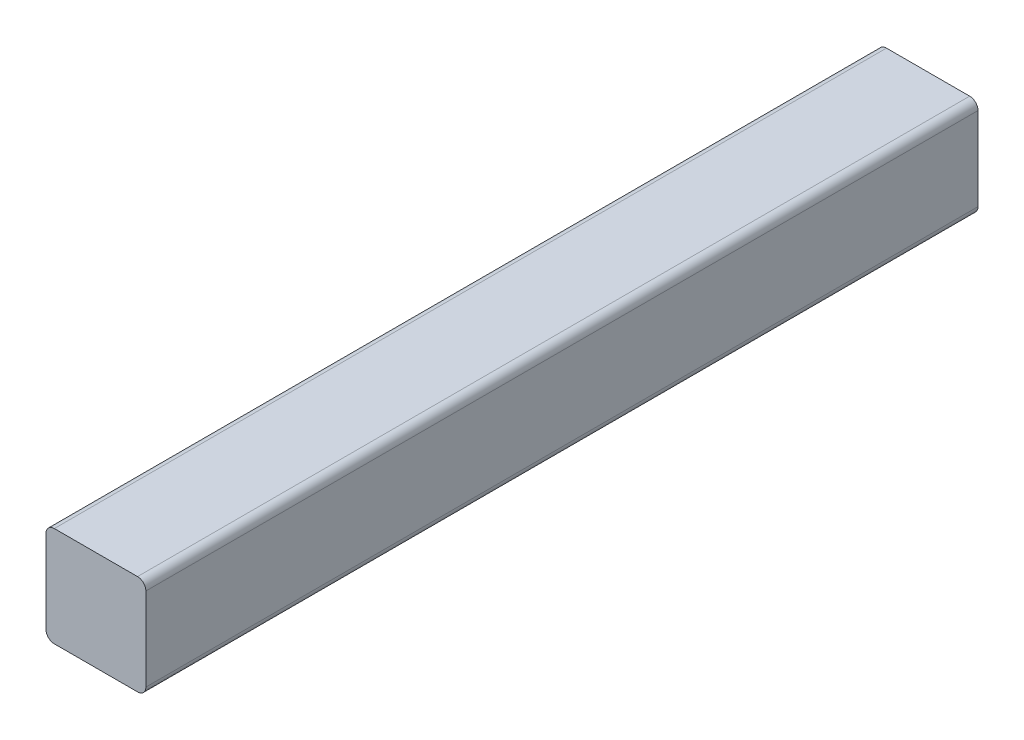
ISO-10303-21;
HEADER;
FILE_DESCRIPTION(('STEP AP214'),'2;1');
FILE_NAME('part.step','',(''),(''),'','','');
FILE_SCHEMA(('AUTOMOTIVE_DESIGN { 1 0 10303 214 1 1 1 1 }'));
ENDSEC;
DATA;
#1=APPLICATION_CONTEXT('core data for automotive mechanical design processes');
#2=APPLICATION_PROTOCOL_DEFINITION('international standard','automotive_design',2000,#1);
#3=PRODUCT_CONTEXT('',#1,'mechanical');
#4=PRODUCT('Part','Part','',(#3));
#5=PRODUCT_RELATED_PRODUCT_CATEGORY('part','',(#4));
#6=PRODUCT_DEFINITION_FORMATION('','',#4);
#7=PRODUCT_DEFINITION_CONTEXT('part definition',#1,'design');
#8=PRODUCT_DEFINITION('design','',#6,#7);
#9=PRODUCT_DEFINITION_SHAPE('','',#8);
#10=(LENGTH_UNIT() NAMED_UNIT(*) SI_UNIT(.MILLI.,.METRE.));
#11=(NAMED_UNIT(*) PLANE_ANGLE_UNIT() SI_UNIT($,.RADIAN.));
#12=(NAMED_UNIT(*) SI_UNIT($,.STERADIAN.) SOLID_ANGLE_UNIT());
#13=UNCERTAINTY_MEASURE_WITH_UNIT(LENGTH_MEASURE(1.E-05),#10,'distance_accuracy_value','');
#14=(GEOMETRIC_REPRESENTATION_CONTEXT(3) GLOBAL_UNCERTAINTY_ASSIGNED_CONTEXT((#13)) GLOBAL_UNIT_ASSIGNED_CONTEXT((#10,
#11,#12)) REPRESENTATION_CONTEXT('',''));
#15=CARTESIAN_POINT('',(0.,0.,0.));
#16=DIRECTION('',(0.,0.,1.));
#17=DIRECTION('',(1.,0.,0.));
#18=AXIS2_PLACEMENT_3D('',#15,#16,#17);
#19=CARTESIAN_POINT('',(19.05,-19.05,317.5));
#20=DIRECTION('',(-1.,0.,0.));
#21=DIRECTION('',(0.,0.,1.));
#22=AXIS2_PLACEMENT_3D('',#19,#20,#21);
#23=PLANE('',#22);
#24=DIRECTION('',(0.,1.,0.));
#25=VECTOR('',#24,1.);
#26=CARTESIAN_POINT('',(19.05,-19.05,317.5));
#27=LINE('',#26,#25);
#28=CARTESIAN_POINT('',(19.05,-15.875,317.5));
#29=VERTEX_POINT('',#28);
#30=CARTESIAN_POINT('',(19.05,15.875,317.5));
#31=VERTEX_POINT('',#30);
#32=EDGE_CURVE('E134',#29,#31,#27,.T.);
#33=ORIENTED_EDGE('',*,*,#32,.F.);
#34=DIRECTION('',(0.,0.,-1.));
#35=VECTOR('',#34,1.);
#36=CARTESIAN_POINT('',(19.05,-15.875,317.5));
#37=LINE('',#36,#35);
#38=CARTESIAN_POINT('',(19.05,-15.875,0.));
#39=VERTEX_POINT('',#38);
#40=EDGE_CURVE('E11',#29,#39,#37,.T.);
#41=ORIENTED_EDGE('',*,*,#40,.T.);
#42=DIRECTION('',(0.,1.,0.));
#43=VECTOR('',#42,1.);
#44=CARTESIAN_POINT('',(19.05,-19.05,0.));
#45=LINE('',#44,#43);
#46=CARTESIAN_POINT('',(19.05,15.875,0.));
#47=VERTEX_POINT('',#46);
#48=EDGE_CURVE('E136',#39,#47,#45,.T.);
#49=ORIENTED_EDGE('',*,*,#48,.T.);
#50=DIRECTION('',(0.,0.,-1.));
#51=VECTOR('',#50,1.);
#52=CARTESIAN_POINT('',(19.05,15.875,317.5));
#53=LINE('',#52,#51);
#54=EDGE_CURVE('E47',#47,#31,#53,.F.);
#55=ORIENTED_EDGE('',*,*,#54,.T.);
#56=EDGE_LOOP('',(#33,#41,#49,#55));
#57=FACE_BOUND('',#56,.T.);
#58=ADVANCED_FACE('F39',(#57),#23,.F.);
#59=CARTESIAN_POINT('',(-19.05,19.05,317.5));
#60=DIRECTION('',(0.,-1.,0.));
#61=DIRECTION('',(0.,0.,-1.));
#62=AXIS2_PLACEMENT_3D('',#59,#60,#61);
#63=PLANE('',#62);
#64=DIRECTION('',(-1.,0.,0.));
#65=VECTOR('',#64,1.);
#66=CARTESIAN_POINT('',(-19.05,19.05,0.));
#67=LINE('',#66,#65);
#68=CARTESIAN_POINT('',(15.875,19.05,0.));
#69=VERTEX_POINT('',#68);
#70=CARTESIAN_POINT('',(-15.875,19.05,0.));
#71=VERTEX_POINT('',#70);
#72=EDGE_CURVE('E132',#69,#71,#67,.T.);
#73=ORIENTED_EDGE('',*,*,#72,.T.);
#74=DIRECTION('',(0.,0.,-1.));
#75=VECTOR('',#74,1.);
#76=CARTESIAN_POINT('',(-15.875,19.05,317.5));
#77=LINE('',#76,#75);
#78=CARTESIAN_POINT('',(-15.875,19.05,317.5));
#79=VERTEX_POINT('',#78);
#80=EDGE_CURVE('E111',#71,#79,#77,.F.);
#81=ORIENTED_EDGE('',*,*,#80,.T.);
#82=DIRECTION('',(-1.,0.,0.));
#83=VECTOR('',#82,1.);
#84=CARTESIAN_POINT('',(-19.05,19.05,317.5));
#85=LINE('',#84,#83);
#86=CARTESIAN_POINT('',(15.875,19.05,317.5));
#87=VERTEX_POINT('',#86);
#88=EDGE_CURVE('E172',#87,#79,#85,.T.);
#89=ORIENTED_EDGE('',*,*,#88,.F.);
#90=DIRECTION('',(0.,0.,-1.));
#91=VECTOR('',#90,1.);
#92=CARTESIAN_POINT('',(15.875,19.05,317.5));
#93=LINE('',#92,#91);
#94=EDGE_CURVE('E116',#87,#69,#93,.T.);
#95=ORIENTED_EDGE('',*,*,#94,.T.);
#96=EDGE_LOOP('',(#73,#81,#89,#95));
#97=FACE_BOUND('',#96,.T.);
#98=ADVANCED_FACE('F176',(#97),#63,.F.);
#99=CARTESIAN_POINT('',(-19.05,-19.05,317.5));
#100=DIRECTION('',(1.,0.,0.));
#101=DIRECTION('',(0.,0.,-1.));
#102=AXIS2_PLACEMENT_3D('',#99,#100,#101);
#103=PLANE('',#102);
#104=DIRECTION('',(0.,-1.,0.));
#105=VECTOR('',#104,1.);
#106=CARTESIAN_POINT('',(-19.05,-19.05,317.5));
#107=LINE('',#106,#105);
#108=CARTESIAN_POINT('',(-19.05,15.875,317.5));
#109=VERTEX_POINT('',#108);
#110=CARTESIAN_POINT('',(-19.05,-15.875,317.5));
#111=VERTEX_POINT('',#110);
#112=EDGE_CURVE('E125',#109,#111,#107,.T.);
#113=ORIENTED_EDGE('',*,*,#112,.F.);
#114=DIRECTION('',(0.,0.,-1.));
#115=VECTOR('',#114,1.);
#116=CARTESIAN_POINT('',(-19.05,15.875,317.5));
#117=LINE('',#116,#115);
#118=CARTESIAN_POINT('',(-19.05,15.875,0.));
#119=VERTEX_POINT('',#118);
#120=EDGE_CURVE('E110',#109,#119,#117,.T.);
#121=ORIENTED_EDGE('',*,*,#120,.T.);
#122=DIRECTION('',(0.,-1.,0.));
#123=VECTOR('',#122,1.);
#124=CARTESIAN_POINT('',(-19.05,-19.05,0.));
#125=LINE('',#124,#123);
#126=CARTESIAN_POINT('',(-19.05,-15.875,0.));
#127=VERTEX_POINT('',#126);
#128=EDGE_CURVE('E123',#119,#127,#125,.T.);
#129=ORIENTED_EDGE('',*,*,#128,.T.);
#130=DIRECTION('',(0.,0.,-1.));
#131=VECTOR('',#130,1.);
#132=CARTESIAN_POINT('',(-19.05,-15.875,317.5));
#133=LINE('',#132,#131);
#134=EDGE_CURVE('E127',#127,#111,#133,.F.);
#135=ORIENTED_EDGE('',*,*,#134,.T.);
#136=EDGE_LOOP('',(#113,#121,#129,#135));
#137=FACE_BOUND('',#136,.T.);
#138=ADVANCED_FACE('F122',(#137),#103,.F.);
#139=CARTESIAN_POINT('',(-19.05,-19.05,317.5));
#140=DIRECTION('',(0.,1.,0.));
#141=DIRECTION('',(0.,0.,1.));
#142=AXIS2_PLACEMENT_3D('',#139,#140,#141);
#143=PLANE('',#142);
#144=DIRECTION('',(1.,0.,0.));
#145=VECTOR('',#144,1.);
#146=CARTESIAN_POINT('',(-19.05,-19.05,317.5));
#147=LINE('',#146,#145);
#148=CARTESIAN_POINT('',(-15.875,-19.05,317.5));
#149=VERTEX_POINT('',#148);
#150=CARTESIAN_POINT('',(15.875,-19.05,317.5));
#151=VERTEX_POINT('',#150);
#152=EDGE_CURVE('E140',#149,#151,#147,.T.);
#153=ORIENTED_EDGE('',*,*,#152,.F.);
#154=DIRECTION('',(0.,0.,-1.));
#155=VECTOR('',#154,1.);
#156=CARTESIAN_POINT('',(-15.875,-19.05,317.5));
#157=LINE('',#156,#155);
#158=CARTESIAN_POINT('',(-15.875,-19.05,0.));
#159=VERTEX_POINT('',#158);
#160=EDGE_CURVE('E157',#149,#159,#157,.T.);
#161=ORIENTED_EDGE('',*,*,#160,.T.);
#162=DIRECTION('',(1.,0.,0.));
#163=VECTOR('',#162,1.);
#164=CARTESIAN_POINT('',(-19.05,-19.05,0.));
#165=LINE('',#164,#163);
#166=CARTESIAN_POINT('',(15.875,-19.05,0.));
#167=VERTEX_POINT('',#166);
#168=EDGE_CURVE('E131',#159,#167,#165,.T.);
#169=ORIENTED_EDGE('',*,*,#168,.T.);
#170=DIRECTION('',(0.,0.,-1.));
#171=VECTOR('',#170,1.);
#172=CARTESIAN_POINT('',(15.875,-19.05,317.5));
#173=LINE('',#172,#171);
#174=EDGE_CURVE('E54',#167,#151,#173,.F.);
#175=ORIENTED_EDGE('',*,*,#174,.T.);
#176=EDGE_LOOP('',(#153,#161,#169,#175));
#177=FACE_BOUND('',#176,.T.);
#178=ADVANCED_FACE('F183',(#177),#143,.F.);
#179=CARTESIAN_POINT('',(0.,0.,317.5));
#180=DIRECTION('',(0.,0.,-1.));
#181=DIRECTION('',(-1.,0.,0.));
#182=AXIS2_PLACEMENT_3D('',#179,#180,#181);
#183=PLANE('',#182);
#184=ORIENTED_EDGE('',*,*,#88,.T.);
#185=CARTESIAN_POINT('',(-15.875,15.875,317.5));
#186=DIRECTION('',(0.,0.,-1.));
#187=DIRECTION('',(-1.,0.,0.));
#188=AXIS2_PLACEMENT_3D('',#185,#186,#187);
#189=CIRCLE('',#188,3.175);
#190=EDGE_CURVE('E154',#79,#109,#189,.F.);
#191=ORIENTED_EDGE('',*,*,#190,.T.);
#192=ORIENTED_EDGE('',*,*,#112,.T.);
#193=CARTESIAN_POINT('',(-15.875,-15.875,317.5));
#194=DIRECTION('',(0.,0.,-1.));
#195=DIRECTION('',(-1.,0.,0.));
#196=AXIS2_PLACEMENT_3D('',#193,#194,#195);
#197=CIRCLE('',#196,3.175);
#198=EDGE_CURVE('E61',#111,#149,#197,.F.);
#199=ORIENTED_EDGE('',*,*,#198,.T.);
#200=ORIENTED_EDGE('',*,*,#152,.T.);
#201=CARTESIAN_POINT('',(15.875,-15.875,317.5));
#202=DIRECTION('',(0.,0.,-1.));
#203=DIRECTION('',(-1.,0.,0.));
#204=AXIS2_PLACEMENT_3D('',#201,#202,#203);
#205=CIRCLE('',#204,3.175);
#206=EDGE_CURVE('E151',#151,#29,#205,.F.);
#207=ORIENTED_EDGE('',*,*,#206,.T.);
#208=ORIENTED_EDGE('',*,*,#32,.T.);
#209=CARTESIAN_POINT('',(15.875,15.875,317.5));
#210=DIRECTION('',(0.,0.,-1.));
#211=DIRECTION('',(-1.,0.,0.));
#212=AXIS2_PLACEMENT_3D('',#209,#210,#211);
#213=CIRCLE('',#212,3.175);
#214=EDGE_CURVE('E149',#31,#87,#213,.F.);
#215=ORIENTED_EDGE('',*,*,#214,.T.);
#216=EDGE_LOOP('',(#184,#191,#192,#199,#200,#207,#208,#215));
#217=FACE_BOUND('',#216,.T.);
#218=ADVANCED_FACE('F169',(#217),#183,.F.);
#219=CARTESIAN_POINT('',(0.,0.,0.));
#220=DIRECTION('',(0.,0.,-1.));
#221=DIRECTION('',(-1.,0.,0.));
#222=AXIS2_PLACEMENT_3D('',#219,#220,#221);
#223=PLANE('',#222);
#224=ORIENTED_EDGE('',*,*,#128,.F.);
#225=CARTESIAN_POINT('',(-15.875,15.875,0.));
#226=DIRECTION('',(0.,0.,-1.));
#227=DIRECTION('',(-1.,0.,0.));
#228=AXIS2_PLACEMENT_3D('',#225,#226,#227);
#229=CIRCLE('',#228,3.175);
#230=EDGE_CURVE('E106',#119,#71,#229,.T.);
#231=ORIENTED_EDGE('',*,*,#230,.T.);
#232=ORIENTED_EDGE('',*,*,#72,.F.);
#233=CARTESIAN_POINT('',(15.875,15.875,0.));
#234=DIRECTION('',(0.,0.,-1.));
#235=DIRECTION('',(-1.,0.,0.));
#236=AXIS2_PLACEMENT_3D('',#233,#234,#235);
#237=CIRCLE('',#236,3.175);
#238=EDGE_CURVE('E126',#69,#47,#237,.T.);
#239=ORIENTED_EDGE('',*,*,#238,.T.);
#240=ORIENTED_EDGE('',*,*,#48,.F.);
#241=CARTESIAN_POINT('',(15.875,-15.875,0.));
#242=DIRECTION('',(0.,0.,-1.));
#243=DIRECTION('',(-1.,0.,0.));
#244=AXIS2_PLACEMENT_3D('',#241,#242,#243);
#245=CIRCLE('',#244,3.175);
#246=EDGE_CURVE('E143',#39,#167,#245,.T.);
#247=ORIENTED_EDGE('',*,*,#246,.T.);
#248=ORIENTED_EDGE('',*,*,#168,.F.);
#249=CARTESIAN_POINT('',(-15.875,-15.875,0.));
#250=DIRECTION('',(0.,0.,-1.));
#251=DIRECTION('',(-1.,0.,0.));
#252=AXIS2_PLACEMENT_3D('',#249,#250,#251);
#253=CIRCLE('',#252,3.175);
#254=EDGE_CURVE('E117',#159,#127,#253,.T.);
#255=ORIENTED_EDGE('',*,*,#254,.T.);
#256=EDGE_LOOP('',(#224,#231,#232,#239,#240,#247,#248,#255));
#257=FACE_BOUND('',#256,.T.);
#258=ADVANCED_FACE('F129',(#257),#223,.T.);
#259=CARTESIAN_POINT('',(-15.875,15.875,317.5));
#260=DIRECTION('',(0.,0.,-1.));
#261=DIRECTION('',(-1.,0.,0.));
#262=AXIS2_PLACEMENT_3D('',#259,#260,#261);
#263=CYLINDRICAL_SURFACE('',#262,3.175);
#264=ORIENTED_EDGE('',*,*,#190,.F.);
#265=ORIENTED_EDGE('',*,*,#80,.F.);
#266=ORIENTED_EDGE('',*,*,#230,.F.);
#267=ORIENTED_EDGE('',*,*,#120,.F.);
#268=EDGE_LOOP('',(#264,#265,#266,#267));
#269=FACE_BOUND('',#268,.T.);
#270=ADVANCED_FACE('F109',(#269),#263,.T.);
#271=CARTESIAN_POINT('',(-15.875,-15.875,317.5));
#272=DIRECTION('',(0.,0.,-1.));
#273=DIRECTION('',(-1.,0.,0.));
#274=AXIS2_PLACEMENT_3D('',#271,#272,#273);
#275=CYLINDRICAL_SURFACE('',#274,3.175);
#276=ORIENTED_EDGE('',*,*,#198,.F.);
#277=ORIENTED_EDGE('',*,*,#134,.F.);
#278=ORIENTED_EDGE('',*,*,#254,.F.);
#279=ORIENTED_EDGE('',*,*,#160,.F.);
#280=EDGE_LOOP('',(#276,#277,#278,#279));
#281=FACE_BOUND('',#280,.T.);
#282=ADVANCED_FACE('F182',(#281),#275,.T.);
#283=CARTESIAN_POINT('',(15.875,-15.875,317.5));
#284=DIRECTION('',(0.,0.,-1.));
#285=DIRECTION('',(-1.,0.,0.));
#286=AXIS2_PLACEMENT_3D('',#283,#284,#285);
#287=CYLINDRICAL_SURFACE('',#286,3.175);
#288=ORIENTED_EDGE('',*,*,#206,.F.);
#289=ORIENTED_EDGE('',*,*,#174,.F.);
#290=ORIENTED_EDGE('',*,*,#246,.F.);
#291=ORIENTED_EDGE('',*,*,#40,.F.);
#292=EDGE_LOOP('',(#288,#289,#290,#291));
#293=FACE_BOUND('',#292,.T.);
#294=ADVANCED_FACE('F185',(#293),#287,.T.);
#295=CARTESIAN_POINT('',(15.875,15.875,317.5));
#296=DIRECTION('',(0.,0.,-1.));
#297=DIRECTION('',(-1.,0.,0.));
#298=AXIS2_PLACEMENT_3D('',#295,#296,#297);
#299=CYLINDRICAL_SURFACE('',#298,3.175);
#300=ORIENTED_EDGE('',*,*,#214,.F.);
#301=ORIENTED_EDGE('',*,*,#54,.F.);
#302=ORIENTED_EDGE('',*,*,#238,.F.);
#303=ORIENTED_EDGE('',*,*,#94,.F.);
#304=EDGE_LOOP('',(#300,#301,#302,#303));
#305=FACE_BOUND('',#304,.T.);
#306=ADVANCED_FACE('F41',(#305),#299,.T.);
#307=CLOSED_SHELL('',(#58,#98,#138,#178,#218,#258,#270,#282,#294,#306));
#308=MANIFOLD_SOLID_BREP('B2',#307);
#309=ADVANCED_BREP_SHAPE_REPRESENTATION('',(#18,#308),#14);
#310=SHAPE_DEFINITION_REPRESENTATION(#9,#309);
ENDSEC;
END-ISO-10303-21;
